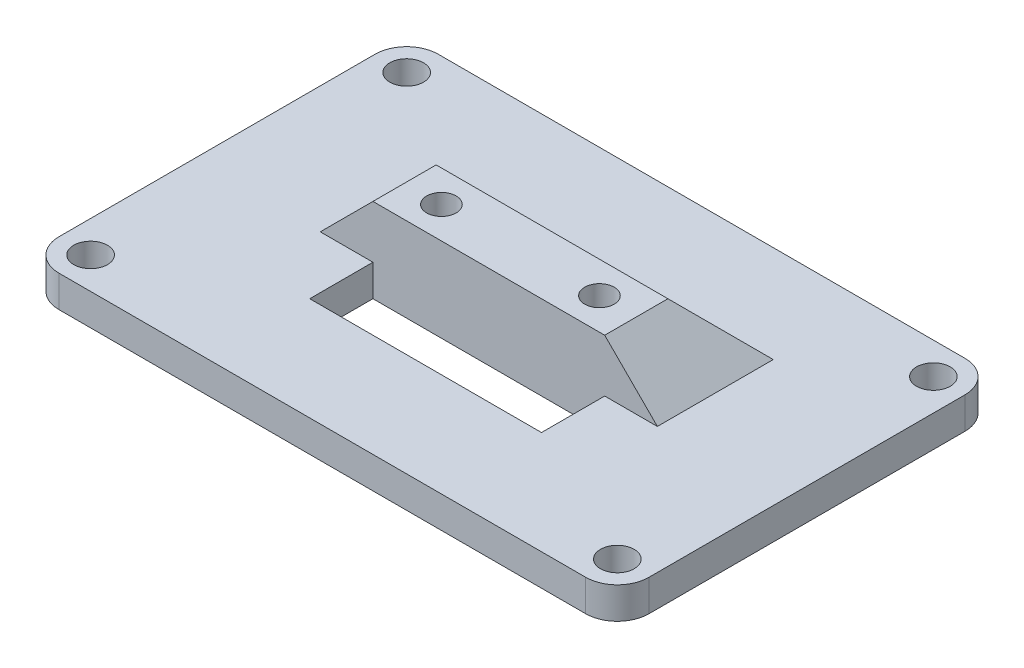
ISO-10303-21;
HEADER;
FILE_DESCRIPTION(('STEP AP214'),'2;1');
FILE_NAME('part.step','',(''),(''),'','','');
FILE_SCHEMA(('AUTOMOTIVE_DESIGN { 1 0 10303 214 1 1 1 1 }'));
ENDSEC;
DATA;
#1=APPLICATION_CONTEXT('core data for automotive mechanical design processes');
#2=APPLICATION_PROTOCOL_DEFINITION('international standard','automotive_design',2000,#1);
#3=PRODUCT_CONTEXT('',#1,'mechanical');
#4=PRODUCT('Part','Part','',(#3));
#5=PRODUCT_RELATED_PRODUCT_CATEGORY('part','',(#4));
#6=PRODUCT_DEFINITION_FORMATION('','',#4);
#7=PRODUCT_DEFINITION_CONTEXT('part definition',#1,'design');
#8=PRODUCT_DEFINITION('design','',#6,#7);
#9=PRODUCT_DEFINITION_SHAPE('','',#8);
#10=(LENGTH_UNIT() NAMED_UNIT(*) SI_UNIT(.MILLI.,.METRE.));
#11=(NAMED_UNIT(*) PLANE_ANGLE_UNIT() SI_UNIT($,.RADIAN.));
#12=(NAMED_UNIT(*) SI_UNIT($,.STERADIAN.) SOLID_ANGLE_UNIT());
#13=UNCERTAINTY_MEASURE_WITH_UNIT(LENGTH_MEASURE(1.E-05),#10,'distance_accuracy_value','');
#14=(GEOMETRIC_REPRESENTATION_CONTEXT(3) GLOBAL_UNCERTAINTY_ASSIGNED_CONTEXT((#13)) GLOBAL_UNIT_ASSIGNED_CONTEXT((#10,
#11,#12)) REPRESENTATION_CONTEXT('',''));
#15=CARTESIAN_POINT('',(0.,0.,0.));
#16=DIRECTION('',(0.,0.,1.));
#17=DIRECTION('',(1.,0.,0.));
#18=AXIS2_PLACEMENT_3D('',#15,#16,#17);
#19=CARTESIAN_POINT('',(0.,3.,0.));
#20=DIRECTION('',(0.,1.,0.));
#21=DIRECTION('',(0.,0.,1.));
#22=AXIS2_PLACEMENT_3D('',#19,#20,#21);
#23=PLANE('',#22);
#24=DIRECTION('',(0.,0.,1.));
#25=VECTOR('',#24,1.);
#26=CARTESIAN_POINT('',(16.,3.,0.));
#27=LINE('',#26,#25);
#28=CARTESIAN_POINT('',(16.,3.,-8.79999999999998));
#29=VERTEX_POINT('',#28);
#30=CARTESIAN_POINT('',(16.,3.,2.2));
#31=VERTEX_POINT('',#30);
#32=EDGE_CURVE('E354',#29,#31,#27,.T.);
#33=ORIENTED_EDGE('',*,*,#32,.T.);
#34=DIRECTION('',(-1.,0.,0.));
#35=VECTOR('',#34,1.);
#36=CARTESIAN_POINT('',(0.,3.,2.2));
#37=LINE('',#36,#35);
#38=CARTESIAN_POINT('',(11.,3.,2.2));
#39=VERTEX_POINT('',#38);
#40=EDGE_CURVE('E363',#31,#39,#37,.T.);
#41=ORIENTED_EDGE('',*,*,#40,.T.);
#42=DIRECTION('',(0.,0.,-1.));
#43=VECTOR('',#42,1.);
#44=CARTESIAN_POINT('',(11.,3.,8.2));
#45=LINE('',#44,#43);
#46=CARTESIAN_POINT('',(11.,3.,8.2));
#47=VERTEX_POINT('',#46);
#48=EDGE_CURVE('E181',#47,#39,#45,.T.);
#49=ORIENTED_EDGE('',*,*,#48,.F.);
#50=DIRECTION('',(1.,0.,0.));
#51=VECTOR('',#50,1.);
#52=CARTESIAN_POINT('',(-11.,3.,8.2));
#53=LINE('',#52,#51);
#54=CARTESIAN_POINT('',(-11.,3.,8.2));
#55=VERTEX_POINT('',#54);
#56=EDGE_CURVE('E185',#55,#47,#53,.T.);
#57=ORIENTED_EDGE('',*,*,#56,.F.);
#58=DIRECTION('',(0.,0.,1.));
#59=VECTOR('',#58,1.);
#60=CARTESIAN_POINT('',(-11.,3.,8.2));
#61=LINE('',#60,#59);
#62=CARTESIAN_POINT('',(-11.,3.,2.2));
#63=VERTEX_POINT('',#62);
#64=EDGE_CURVE('E160',#63,#55,#61,.T.);
#65=ORIENTED_EDGE('',*,*,#64,.F.);
#66=DIRECTION('',(-1.,0.,0.));
#67=VECTOR('',#66,1.);
#68=CARTESIAN_POINT('',(0.,3.,2.2));
#69=LINE('',#68,#67);
#70=CARTESIAN_POINT('',(-16.,3.,2.2));
#71=VERTEX_POINT('',#70);
#72=EDGE_CURVE('E59',#63,#71,#69,.T.);
#73=ORIENTED_EDGE('',*,*,#72,.T.);
#74=DIRECTION('',(0.,0.,-1.));
#75=VECTOR('',#74,1.);
#76=CARTESIAN_POINT('',(-16.,3.,0.));
#77=LINE('',#76,#75);
#78=CARTESIAN_POINT('',(-16.,3.,-8.79999999999998));
#79=VERTEX_POINT('',#78);
#80=EDGE_CURVE('E358',#71,#79,#77,.T.);
#81=ORIENTED_EDGE('',*,*,#80,.T.);
#82=DIRECTION('',(1.,0.,0.));
#83=VECTOR('',#82,1.);
#84=CARTESIAN_POINT('',(0.,3.,-8.79999999999998));
#85=LINE('',#84,#83);
#86=EDGE_CURVE('E351',#79,#29,#85,.T.);
#87=ORIENTED_EDGE('',*,*,#86,.T.);
#88=EDGE_LOOP('',(#33,#41,#49,#57,#65,#73,#81,#87));
#89=FACE_BOUND('',#88,.T.);
#90=CARTESIAN_POINT('',(25.,3.,15.));
#91=DIRECTION('',(0.,1.,0.));
#92=DIRECTION('',(0.,0.,1.));
#93=AXIS2_PLACEMENT_3D('',#90,#91,#92);
#94=CIRCLE('',#93,1.6);
#95=CARTESIAN_POINT('',(25.,3.,16.6));
#96=VERTEX_POINT('',#95);
#97=EDGE_CURVE('E236',#96,#96,#94,.T.);
#98=ORIENTED_EDGE('',*,*,#97,.F.);
#99=EDGE_LOOP('',(#98));
#100=FACE_BOUND('',#99,.T.);
#101=CARTESIAN_POINT('',(-25.,3.,-15.));
#102=DIRECTION('',(0.,1.,0.));
#103=DIRECTION('',(0.,0.,1.));
#104=AXIS2_PLACEMENT_3D('',#101,#102,#103);
#105=CIRCLE('',#104,1.6);
#106=CARTESIAN_POINT('',(-25.,3.,-13.4));
#107=VERTEX_POINT('',#106);
#108=EDGE_CURVE('E252',#107,#107,#105,.T.);
#109=ORIENTED_EDGE('',*,*,#108,.F.);
#110=EDGE_LOOP('',(#109));
#111=FACE_BOUND('',#110,.T.);
#112=DIRECTION('',(-1.,0.,0.));
#113=VECTOR('',#112,1.);
#114=CARTESIAN_POINT('',(-28.,3.,-18.));
#115=LINE('',#114,#113);
#116=CARTESIAN_POINT('',(25.,3.,-18.));
#117=VERTEX_POINT('',#116);
#118=CARTESIAN_POINT('',(-25.,3.,-18.));
#119=VERTEX_POINT('',#118);
#120=EDGE_CURVE('E264',#117,#119,#115,.T.);
#121=ORIENTED_EDGE('',*,*,#120,.T.);
#122=CARTESIAN_POINT('',(-25.,3.,-15.));
#123=DIRECTION('',(0.,1.,0.));
#124=DIRECTION('',(0.,0.,1.));
#125=AXIS2_PLACEMENT_3D('',#122,#123,#124);
#126=CIRCLE('',#125,3.);
#127=CARTESIAN_POINT('',(-28.,3.,-15.));
#128=VERTEX_POINT('',#127);
#129=EDGE_CURVE('E326',#119,#128,#126,.T.);
#130=ORIENTED_EDGE('',*,*,#129,.T.);
#131=DIRECTION('',(0.,0.,1.));
#132=VECTOR('',#131,1.);
#133=CARTESIAN_POINT('',(-28.,3.,-18.));
#134=LINE('',#133,#132);
#135=CARTESIAN_POINT('',(-28.,3.,15.));
#136=VERTEX_POINT('',#135);
#137=EDGE_CURVE('E269',#128,#136,#134,.T.);
#138=ORIENTED_EDGE('',*,*,#137,.T.);
#139=CARTESIAN_POINT('',(-25.,3.,15.));
#140=DIRECTION('',(0.,1.,0.));
#141=DIRECTION('',(0.,0.,1.));
#142=AXIS2_PLACEMENT_3D('',#139,#140,#141);
#143=CIRCLE('',#142,3.);
#144=CARTESIAN_POINT('',(-25.,3.,18.));
#145=VERTEX_POINT('',#144);
#146=EDGE_CURVE('E317',#136,#145,#143,.T.);
#147=ORIENTED_EDGE('',*,*,#146,.T.);
#148=DIRECTION('',(1.,0.,0.));
#149=VECTOR('',#148,1.);
#150=CARTESIAN_POINT('',(-28.,3.,18.));
#151=LINE('',#150,#149);
#152=CARTESIAN_POINT('',(25.,3.,18.));
#153=VERTEX_POINT('',#152);
#154=EDGE_CURVE('E273',#145,#153,#151,.T.);
#155=ORIENTED_EDGE('',*,*,#154,.T.);
#156=CARTESIAN_POINT('',(25.,3.,15.));
#157=DIRECTION('',(0.,1.,0.));
#158=DIRECTION('',(0.,0.,1.));
#159=AXIS2_PLACEMENT_3D('',#156,#157,#158);
#160=CIRCLE('',#159,3.);
#161=CARTESIAN_POINT('',(28.,3.,15.));
#162=VERTEX_POINT('',#161);
#163=EDGE_CURVE('E320',#153,#162,#160,.T.);
#164=ORIENTED_EDGE('',*,*,#163,.T.);
#165=DIRECTION('',(0.,0.,-1.));
#166=VECTOR('',#165,1.);
#167=CARTESIAN_POINT('',(28.,3.,-18.));
#168=LINE('',#167,#166);
#169=CARTESIAN_POINT('',(28.,3.,-15.));
#170=VERTEX_POINT('',#169);
#171=EDGE_CURVE('E260',#162,#170,#168,.T.);
#172=ORIENTED_EDGE('',*,*,#171,.T.);
#173=CARTESIAN_POINT('',(25.,3.,-15.));
#174=DIRECTION('',(0.,1.,0.));
#175=DIRECTION('',(0.,0.,1.));
#176=AXIS2_PLACEMENT_3D('',#173,#174,#175);
#177=CIRCLE('',#176,3.);
#178=EDGE_CURVE('E323',#170,#117,#177,.T.);
#179=ORIENTED_EDGE('',*,*,#178,.T.);
#180=EDGE_LOOP('',(#121,#130,#138,#147,#155,#164,#172,#179));
#181=FACE_BOUND('',#180,.T.);
#182=CARTESIAN_POINT('',(25.,3.,-15.));
#183=DIRECTION('',(0.,1.,0.));
#184=DIRECTION('',(0.,0.,1.));
#185=AXIS2_PLACEMENT_3D('',#182,#183,#184);
#186=CIRCLE('',#185,1.6);
#187=CARTESIAN_POINT('',(25.,3.,-13.4));
#188=VERTEX_POINT('',#187);
#189=EDGE_CURVE('E244',#188,#188,#186,.T.);
#190=ORIENTED_EDGE('',*,*,#189,.F.);
#191=EDGE_LOOP('',(#190));
#192=FACE_BOUND('',#191,.T.);
#193=CARTESIAN_POINT('',(-25.,3.,15.));
#194=DIRECTION('',(0.,1.,0.));
#195=DIRECTION('',(0.,0.,1.));
#196=AXIS2_PLACEMENT_3D('',#193,#194,#195);
#197=CIRCLE('',#196,1.6);
#198=CARTESIAN_POINT('',(-25.,3.,16.6));
#199=VERTEX_POINT('',#198);
#200=EDGE_CURVE('E228',#199,#199,#197,.T.);
#201=ORIENTED_EDGE('',*,*,#200,.F.);
#202=EDGE_LOOP('',(#201));
#203=FACE_BOUND('',#202,.T.);
#204=ADVANCED_FACE('F40',(#89,#100,#111,#181,#192,#203),#23,.T.);
#205=CARTESIAN_POINT('',(0.,0.,0.));
#206=DIRECTION('',(0.,1.,0.));
#207=DIRECTION('',(0.,0.,1.));
#208=AXIS2_PLACEMENT_3D('',#205,#206,#207);
#209=PLANE('',#208);
#210=DIRECTION('',(-1.,0.,0.));
#211=VECTOR('',#210,1.);
#212=CARTESIAN_POINT('',(-11.,0.,2.2));
#213=LINE('',#212,#211);
#214=CARTESIAN_POINT('',(11.,0.,2.2));
#215=VERTEX_POINT('',#214);
#216=CARTESIAN_POINT('',(-11.,0.,2.2));
#217=VERTEX_POINT('',#216);
#218=EDGE_CURVE('E166',#215,#217,#213,.T.);
#219=ORIENTED_EDGE('',*,*,#218,.T.);
#220=DIRECTION('',(0.,0.,1.));
#221=VECTOR('',#220,1.);
#222=CARTESIAN_POINT('',(-11.,0.,8.2));
#223=LINE('',#222,#221);
#224=CARTESIAN_POINT('',(-11.,0.,8.2));
#225=VERTEX_POINT('',#224);
#226=EDGE_CURVE('E158',#217,#225,#223,.T.);
#227=ORIENTED_EDGE('',*,*,#226,.T.);
#228=DIRECTION('',(1.,0.,0.));
#229=VECTOR('',#228,1.);
#230=CARTESIAN_POINT('',(-11.,0.,8.2));
#231=LINE('',#230,#229);
#232=CARTESIAN_POINT('',(11.,0.,8.2));
#233=VERTEX_POINT('',#232);
#234=EDGE_CURVE('E170',#225,#233,#231,.T.);
#235=ORIENTED_EDGE('',*,*,#234,.T.);
#236=DIRECTION('',(0.,0.,-1.));
#237=VECTOR('',#236,1.);
#238=CARTESIAN_POINT('',(11.,0.,8.2));
#239=LINE('',#238,#237);
#240=EDGE_CURVE('E175',#233,#215,#239,.T.);
#241=ORIENTED_EDGE('',*,*,#240,.T.);
#242=EDGE_LOOP('',(#219,#227,#235,#241));
#243=FACE_BOUND('',#242,.T.);
#244=DIRECTION('',(0.,0.,1.));
#245=VECTOR('',#244,1.);
#246=CARTESIAN_POINT('',(-28.,0.,-18.));
#247=LINE('',#246,#245);
#248=CARTESIAN_POINT('',(-28.,0.,-15.));
#249=VERTEX_POINT('',#248);
#250=CARTESIAN_POINT('',(-28.,0.,15.));
#251=VERTEX_POINT('',#250);
#252=EDGE_CURVE('E285',#249,#251,#247,.T.);
#253=ORIENTED_EDGE('',*,*,#252,.F.);
#254=CARTESIAN_POINT('',(-25.,0.,-15.));
#255=DIRECTION('',(0.,1.,0.));
#256=DIRECTION('',(0.,0.,1.));
#257=AXIS2_PLACEMENT_3D('',#254,#255,#256);
#258=CIRCLE('',#257,3.);
#259=CARTESIAN_POINT('',(-25.,0.,-18.));
#260=VERTEX_POINT('',#259);
#261=EDGE_CURVE('E307',#249,#260,#258,.F.);
#262=ORIENTED_EDGE('',*,*,#261,.T.);
#263=DIRECTION('',(-1.,0.,0.));
#264=VECTOR('',#263,1.);
#265=CARTESIAN_POINT('',(-28.,0.,-18.));
#266=LINE('',#265,#264);
#267=CARTESIAN_POINT('',(25.,0.,-18.));
#268=VERTEX_POINT('',#267);
#269=EDGE_CURVE('E281',#268,#260,#266,.T.);
#270=ORIENTED_EDGE('',*,*,#269,.F.);
#271=CARTESIAN_POINT('',(25.,0.,-15.));
#272=DIRECTION('',(0.,1.,0.));
#273=DIRECTION('',(0.,0.,1.));
#274=AXIS2_PLACEMENT_3D('',#271,#272,#273);
#275=CIRCLE('',#274,3.);
#276=CARTESIAN_POINT('',(28.,0.,-15.));
#277=VERTEX_POINT('',#276);
#278=EDGE_CURVE('E304',#268,#277,#275,.F.);
#279=ORIENTED_EDGE('',*,*,#278,.T.);
#280=DIRECTION('',(0.,0.,-1.));
#281=VECTOR('',#280,1.);
#282=CARTESIAN_POINT('',(28.,0.,-18.));
#283=LINE('',#282,#281);
#284=CARTESIAN_POINT('',(28.,0.,15.));
#285=VERTEX_POINT('',#284);
#286=EDGE_CURVE('E256',#285,#277,#283,.T.);
#287=ORIENTED_EDGE('',*,*,#286,.F.);
#288=CARTESIAN_POINT('',(25.,0.,15.));
#289=DIRECTION('',(0.,1.,0.));
#290=DIRECTION('',(0.,0.,1.));
#291=AXIS2_PLACEMENT_3D('',#288,#289,#290);
#292=CIRCLE('',#291,3.);
#293=CARTESIAN_POINT('',(25.,0.,18.));
#294=VERTEX_POINT('',#293);
#295=EDGE_CURVE('E301',#285,#294,#292,.F.);
#296=ORIENTED_EDGE('',*,*,#295,.T.);
#297=DIRECTION('',(1.,0.,0.));
#298=VECTOR('',#297,1.);
#299=CARTESIAN_POINT('',(-28.,0.,18.));
#300=LINE('',#299,#298);
#301=CARTESIAN_POINT('',(-25.,0.,18.));
#302=VERTEX_POINT('',#301);
#303=EDGE_CURVE('E265',#302,#294,#300,.T.);
#304=ORIENTED_EDGE('',*,*,#303,.F.);
#305=CARTESIAN_POINT('',(-25.,0.,15.));
#306=DIRECTION('',(0.,1.,0.));
#307=DIRECTION('',(0.,0.,1.));
#308=AXIS2_PLACEMENT_3D('',#305,#306,#307);
#309=CIRCLE('',#308,3.);
#310=EDGE_CURVE('E298',#302,#251,#309,.F.);
#311=ORIENTED_EDGE('',*,*,#310,.T.);
#312=EDGE_LOOP('',(#253,#262,#270,#279,#287,#296,#304,#311));
#313=FACE_BOUND('',#312,.T.);
#314=CARTESIAN_POINT('',(-25.,0.,-15.));
#315=DIRECTION('',(0.,1.,0.));
#316=DIRECTION('',(0.,0.,1.));
#317=AXIS2_PLACEMENT_3D('',#314,#315,#316);
#318=CIRCLE('',#317,1.6);
#319=CARTESIAN_POINT('',(-25.,0.,-13.4));
#320=VERTEX_POINT('',#319);
#321=EDGE_CURVE('E248',#320,#320,#318,.T.);
#322=ORIENTED_EDGE('',*,*,#321,.T.);
#323=EDGE_LOOP('',(#322));
#324=FACE_BOUND('',#323,.T.);
#325=CARTESIAN_POINT('',(25.,0.,-15.));
#326=DIRECTION('',(0.,1.,0.));
#327=DIRECTION('',(0.,0.,1.));
#328=AXIS2_PLACEMENT_3D('',#325,#326,#327);
#329=CIRCLE('',#328,1.6);
#330=CARTESIAN_POINT('',(25.,0.,-13.4));
#331=VERTEX_POINT('',#330);
#332=EDGE_CURVE('E240',#331,#331,#329,.T.);
#333=ORIENTED_EDGE('',*,*,#332,.T.);
#334=EDGE_LOOP('',(#333));
#335=FACE_BOUND('',#334,.T.);
#336=CARTESIAN_POINT('',(25.,0.,15.));
#337=DIRECTION('',(0.,1.,0.));
#338=DIRECTION('',(0.,0.,1.));
#339=AXIS2_PLACEMENT_3D('',#336,#337,#338);
#340=CIRCLE('',#339,1.6);
#341=CARTESIAN_POINT('',(25.,0.,16.6));
#342=VERTEX_POINT('',#341);
#343=EDGE_CURVE('E232',#342,#342,#340,.T.);
#344=ORIENTED_EDGE('',*,*,#343,.T.);
#345=EDGE_LOOP('',(#344));
#346=FACE_BOUND('',#345,.T.);
#347=CARTESIAN_POINT('',(-25.,0.,15.));
#348=DIRECTION('',(0.,1.,0.));
#349=DIRECTION('',(0.,0.,1.));
#350=AXIS2_PLACEMENT_3D('',#347,#348,#349);
#351=CIRCLE('',#350,1.6);
#352=CARTESIAN_POINT('',(-25.,0.,16.6));
#353=VERTEX_POINT('',#352);
#354=EDGE_CURVE('E227',#353,#353,#351,.T.);
#355=ORIENTED_EDGE('',*,*,#354,.T.);
#356=EDGE_LOOP('',(#355));
#357=FACE_BOUND('',#356,.T.);
#358=ADVANCED_FACE('F177',(#243,#313,#324,#335,#346,#357),#209,.F.);
#359=CARTESIAN_POINT('',(28.,3.,-18.));
#360=DIRECTION('',(-1.,0.,0.));
#361=DIRECTION('',(0.,0.,1.));
#362=AXIS2_PLACEMENT_3D('',#359,#360,#361);
#363=PLANE('',#362);
#364=ORIENTED_EDGE('',*,*,#286,.T.);
#365=DIRECTION('',(0.,-1.,0.));
#366=VECTOR('',#365,1.);
#367=CARTESIAN_POINT('',(28.,3.,-15.));
#368=LINE('',#367,#366);
#369=EDGE_CURVE('E333',#277,#170,#368,.F.);
#370=ORIENTED_EDGE('',*,*,#369,.T.);
#371=ORIENTED_EDGE('',*,*,#171,.F.);
#372=DIRECTION('',(0.,-1.,0.));
#373=VECTOR('',#372,1.);
#374=CARTESIAN_POINT('',(28.,3.,15.));
#375=LINE('',#374,#373);
#376=EDGE_CURVE('E329',#162,#285,#375,.T.);
#377=ORIENTED_EDGE('',*,*,#376,.T.);
#378=EDGE_LOOP('',(#364,#370,#371,#377));
#379=FACE_BOUND('',#378,.T.);
#380=ADVANCED_FACE('F412',(#379),#363,.F.);
#381=CARTESIAN_POINT('',(-28.,3.,-18.));
#382=DIRECTION('',(0.,0.,1.));
#383=DIRECTION('',(1.,0.,0.));
#384=AXIS2_PLACEMENT_3D('',#381,#382,#383);
#385=PLANE('',#384);
#386=ORIENTED_EDGE('',*,*,#269,.T.);
#387=DIRECTION('',(0.,-1.,0.));
#388=VECTOR('',#387,1.);
#389=CARTESIAN_POINT('',(-25.,3.,-18.));
#390=LINE('',#389,#388);
#391=EDGE_CURVE('E314',#260,#119,#390,.F.);
#392=ORIENTED_EDGE('',*,*,#391,.T.);
#393=ORIENTED_EDGE('',*,*,#120,.F.);
#394=DIRECTION('',(0.,-1.,0.));
#395=VECTOR('',#394,1.);
#396=CARTESIAN_POINT('',(25.,3.,-18.));
#397=LINE('',#396,#395);
#398=EDGE_CURVE('E310',#117,#268,#397,.T.);
#399=ORIENTED_EDGE('',*,*,#398,.T.);
#400=EDGE_LOOP('',(#386,#392,#393,#399));
#401=FACE_BOUND('',#400,.T.);
#402=ADVANCED_FACE('F509',(#401),#385,.F.);
#403=CARTESIAN_POINT('',(-28.,3.,-18.));
#404=DIRECTION('',(1.,0.,0.));
#405=DIRECTION('',(0.,0.,-1.));
#406=AXIS2_PLACEMENT_3D('',#403,#404,#405);
#407=PLANE('',#406);
#408=ORIENTED_EDGE('',*,*,#137,.F.);
#409=DIRECTION('',(0.,-1.,0.));
#410=VECTOR('',#409,1.);
#411=CARTESIAN_POINT('',(-28.,3.,-15.));
#412=LINE('',#411,#410);
#413=EDGE_CURVE('E294',#128,#249,#412,.T.);
#414=ORIENTED_EDGE('',*,*,#413,.T.);
#415=ORIENTED_EDGE('',*,*,#252,.T.);
#416=DIRECTION('',(0.,-1.,0.));
#417=VECTOR('',#416,1.);
#418=CARTESIAN_POINT('',(-28.,3.,15.));
#419=LINE('',#418,#417);
#420=EDGE_CURVE('E277',#251,#136,#419,.F.);
#421=ORIENTED_EDGE('',*,*,#420,.T.);
#422=EDGE_LOOP('',(#408,#414,#415,#421));
#423=FACE_BOUND('',#422,.T.);
#424=ADVANCED_FACE('F458',(#423),#407,.F.);
#425=CARTESIAN_POINT('',(-28.,3.,18.));
#426=DIRECTION('',(0.,0.,-1.));
#427=DIRECTION('',(-1.,0.,0.));
#428=AXIS2_PLACEMENT_3D('',#425,#426,#427);
#429=PLANE('',#428);
#430=ORIENTED_EDGE('',*,*,#303,.T.);
#431=DIRECTION('',(0.,-1.,0.));
#432=VECTOR('',#431,1.);
#433=CARTESIAN_POINT('',(25.,3.,18.));
#434=LINE('',#433,#432);
#435=EDGE_CURVE('E340',#294,#153,#434,.F.);
#436=ORIENTED_EDGE('',*,*,#435,.T.);
#437=ORIENTED_EDGE('',*,*,#154,.F.);
#438=DIRECTION('',(0.,-1.,0.));
#439=VECTOR('',#438,1.);
#440=CARTESIAN_POINT('',(-25.,3.,18.));
#441=LINE('',#440,#439);
#442=EDGE_CURVE('E336',#145,#302,#441,.T.);
#443=ORIENTED_EDGE('',*,*,#442,.T.);
#444=EDGE_LOOP('',(#430,#436,#437,#443));
#445=FACE_BOUND('',#444,.T.);
#446=ADVANCED_FACE('F453',(#445),#429,.F.);
#447=CARTESIAN_POINT('',(-25.,3.,-15.));
#448=DIRECTION('',(0.,-1.,0.));
#449=DIRECTION('',(0.,0.,-1.));
#450=AXIS2_PLACEMENT_3D('',#447,#448,#449);
#451=CYLINDRICAL_SURFACE('',#450,1.6);
#452=ORIENTED_EDGE('',*,*,#108,.T.);
#453=EDGE_LOOP('',(#452));
#454=FACE_BOUND('',#453,.T.);
#455=ORIENTED_EDGE('',*,*,#321,.F.);
#456=EDGE_LOOP('',(#455));
#457=FACE_BOUND('',#456,.T.);
#458=ADVANCED_FACE('F450',(#454,#457),#451,.F.);
#459=CARTESIAN_POINT('',(25.,3.,-15.));
#460=DIRECTION('',(0.,-1.,0.));
#461=DIRECTION('',(0.,0.,-1.));
#462=AXIS2_PLACEMENT_3D('',#459,#460,#461);
#463=CYLINDRICAL_SURFACE('',#462,1.6);
#464=ORIENTED_EDGE('',*,*,#189,.T.);
#465=EDGE_LOOP('',(#464));
#466=FACE_BOUND('',#465,.T.);
#467=ORIENTED_EDGE('',*,*,#332,.F.);
#468=EDGE_LOOP('',(#467));
#469=FACE_BOUND('',#468,.T.);
#470=ADVANCED_FACE('F447',(#466,#469),#463,.F.);
#471=CARTESIAN_POINT('',(25.,3.,15.));
#472=DIRECTION('',(0.,-1.,0.));
#473=DIRECTION('',(0.,0.,-1.));
#474=AXIS2_PLACEMENT_3D('',#471,#472,#473);
#475=CYLINDRICAL_SURFACE('',#474,1.6);
#476=ORIENTED_EDGE('',*,*,#97,.T.);
#477=EDGE_LOOP('',(#476));
#478=FACE_BOUND('',#477,.T.);
#479=ORIENTED_EDGE('',*,*,#343,.F.);
#480=EDGE_LOOP('',(#479));
#481=FACE_BOUND('',#480,.T.);
#482=ADVANCED_FACE('F443',(#478,#481),#475,.F.);
#483=CARTESIAN_POINT('',(-25.,3.,15.));
#484=DIRECTION('',(0.,-1.,0.));
#485=DIRECTION('',(0.,0.,-1.));
#486=AXIS2_PLACEMENT_3D('',#483,#484,#485);
#487=CYLINDRICAL_SURFACE('',#486,1.6);
#488=ORIENTED_EDGE('',*,*,#200,.T.);
#489=EDGE_LOOP('',(#488));
#490=FACE_BOUND('',#489,.T.);
#491=ORIENTED_EDGE('',*,*,#354,.F.);
#492=EDGE_LOOP('',(#491));
#493=FACE_BOUND('',#492,.T.);
#494=ADVANCED_FACE('F439',(#490,#493),#487,.F.);
#495=CARTESIAN_POINT('',(-25.,3.,-15.));
#496=DIRECTION('',(0.,-1.,0.));
#497=DIRECTION('',(0.,0.,-1.));
#498=AXIS2_PLACEMENT_3D('',#495,#496,#497);
#499=CYLINDRICAL_SURFACE('',#498,3.);
#500=ORIENTED_EDGE('',*,*,#129,.F.);
#501=ORIENTED_EDGE('',*,*,#391,.F.);
#502=ORIENTED_EDGE('',*,*,#261,.F.);
#503=ORIENTED_EDGE('',*,*,#413,.F.);
#504=EDGE_LOOP('',(#500,#501,#502,#503));
#505=FACE_BOUND('',#504,.T.);
#506=ADVANCED_FACE('F442',(#505),#499,.T.);
#507=CARTESIAN_POINT('',(25.,3.,-15.));
#508=DIRECTION('',(0.,-1.,0.));
#509=DIRECTION('',(0.,0.,-1.));
#510=AXIS2_PLACEMENT_3D('',#507,#508,#509);
#511=CYLINDRICAL_SURFACE('',#510,3.);
#512=ORIENTED_EDGE('',*,*,#178,.F.);
#513=ORIENTED_EDGE('',*,*,#369,.F.);
#514=ORIENTED_EDGE('',*,*,#278,.F.);
#515=ORIENTED_EDGE('',*,*,#398,.F.);
#516=EDGE_LOOP('',(#512,#513,#514,#515));
#517=FACE_BOUND('',#516,.T.);
#518=ADVANCED_FACE('F508',(#517),#511,.T.);
#519=CARTESIAN_POINT('',(25.,3.,15.));
#520=DIRECTION('',(0.,-1.,0.));
#521=DIRECTION('',(0.,0.,-1.));
#522=AXIS2_PLACEMENT_3D('',#519,#520,#521);
#523=CYLINDRICAL_SURFACE('',#522,3.);
#524=ORIENTED_EDGE('',*,*,#163,.F.);
#525=ORIENTED_EDGE('',*,*,#435,.F.);
#526=ORIENTED_EDGE('',*,*,#295,.F.);
#527=ORIENTED_EDGE('',*,*,#376,.F.);
#528=EDGE_LOOP('',(#524,#525,#526,#527));
#529=FACE_BOUND('',#528,.T.);
#530=ADVANCED_FACE('F503',(#529),#523,.T.);
#531=CARTESIAN_POINT('',(-25.,3.,15.));
#532=DIRECTION('',(0.,-1.,0.));
#533=DIRECTION('',(0.,0.,-1.));
#534=AXIS2_PLACEMENT_3D('',#531,#532,#533);
#535=CYLINDRICAL_SURFACE('',#534,3.);
#536=ORIENTED_EDGE('',*,*,#146,.F.);
#537=ORIENTED_EDGE('',*,*,#420,.F.);
#538=ORIENTED_EDGE('',*,*,#310,.F.);
#539=ORIENTED_EDGE('',*,*,#442,.F.);
#540=EDGE_LOOP('',(#536,#537,#538,#539));
#541=FACE_BOUND('',#540,.T.);
#542=ADVANCED_FACE('F435',(#541),#535,.T.);
#543=CARTESIAN_POINT('',(0.,8.,0.));
#544=DIRECTION('',(0.,1.,0.));
#545=DIRECTION('',(0.,0.,1.));
#546=AXIS2_PLACEMENT_3D('',#543,#544,#545);
#547=PLANE('',#546);
#548=CARTESIAN_POINT('',(-7.5,8.,-0.8));
#549=DIRECTION('',(0.,1.,0.));
#550=DIRECTION('',(0.,0.,1.));
#551=AXIS2_PLACEMENT_3D('',#548,#549,#550);
#552=CIRCLE('',#551,1.4);
#553=CARTESIAN_POINT('',(-7.5,8.,0.6));
#554=VERTEX_POINT('',#553);
#555=EDGE_CURVE('E209',#554,#554,#552,.T.);
#556=ORIENTED_EDGE('',*,*,#555,.F.);
#557=EDGE_LOOP('',(#556));
#558=FACE_BOUND('',#557,.T.);
#559=DIRECTION('',(0.,0.,-1.));
#560=VECTOR('',#559,1.);
#561=CARTESIAN_POINT('',(11.,8.,-3.8));
#562=LINE('',#561,#560);
#563=CARTESIAN_POINT('',(11.,8.,2.2));
#564=VERTEX_POINT('',#563);
#565=CARTESIAN_POINT('',(11.,8.,-3.8));
#566=VERTEX_POINT('',#565);
#567=EDGE_CURVE('E213',#564,#566,#562,.T.);
#568=ORIENTED_EDGE('',*,*,#567,.T.);
#569=DIRECTION('',(-1.,0.,0.));
#570=VECTOR('',#569,1.);
#571=CARTESIAN_POINT('',(-11.,8.,-3.8));
#572=LINE('',#571,#570);
#573=CARTESIAN_POINT('',(-11.,8.,-3.8));
#574=VERTEX_POINT('',#573);
#575=EDGE_CURVE('E216',#566,#574,#572,.T.);
#576=ORIENTED_EDGE('',*,*,#575,.T.);
#577=DIRECTION('',(0.,0.,1.));
#578=VECTOR('',#577,1.);
#579=CARTESIAN_POINT('',(-11.,8.,-3.8));
#580=LINE('',#579,#578);
#581=CARTESIAN_POINT('',(-11.,8.,2.2));
#582=VERTEX_POINT('',#581);
#583=EDGE_CURVE('E219',#574,#582,#580,.T.);
#584=ORIENTED_EDGE('',*,*,#583,.T.);
#585=DIRECTION('',(1.,0.,0.));
#586=VECTOR('',#585,1.);
#587=CARTESIAN_POINT('',(-11.,8.,2.2));
#588=LINE('',#587,#586);
#589=EDGE_CURVE('E223',#582,#564,#588,.T.);
#590=ORIENTED_EDGE('',*,*,#589,.T.);
#591=EDGE_LOOP('',(#568,#576,#584,#590));
#592=FACE_BOUND('',#591,.T.);
#593=CARTESIAN_POINT('',(7.5,8.,-0.800000000000003));
#594=DIRECTION('',(0.,1.,0.));
#595=DIRECTION('',(0.,0.,1.));
#596=AXIS2_PLACEMENT_3D('',#593,#594,#595);
#597=CIRCLE('',#596,1.4);
#598=CARTESIAN_POINT('',(7.5,8.,0.599999999999997));
#599=VERTEX_POINT('',#598);
#600=EDGE_CURVE('E199',#599,#599,#597,.T.);
#601=ORIENTED_EDGE('',*,*,#600,.F.);
#602=EDGE_LOOP('',(#601));
#603=FACE_BOUND('',#602,.T.);
#604=ADVANCED_FACE('F390',(#558,#592,#603),#547,.T.);
#605=CARTESIAN_POINT('',(-11.,8.,2.2));
#606=DIRECTION('',(0.,0.,-1.));
#607=DIRECTION('',(-1.,0.,0.));
#608=AXIS2_PLACEMENT_3D('',#605,#606,#607);
#609=PLANE('',#608);
#610=ORIENTED_EDGE('',*,*,#589,.F.);
#611=DIRECTION('',(-0.707106781186546,-0.707106781186549,0.));
#612=VECTOR('',#611,1.);
#613=CARTESIAN_POINT('',(-11.,8.,2.2));
#614=LINE('',#613,#612);
#615=EDGE_CURVE('E51',#582,#71,#614,.T.);
#616=ORIENTED_EDGE('',*,*,#615,.T.);
#617=ORIENTED_EDGE('',*,*,#72,.F.);
#618=DIRECTION('',(0.,1.,0.));
#619=VECTOR('',#618,1.);
#620=CARTESIAN_POINT('',(-11.,0.,2.2));
#621=LINE('',#620,#619);
#622=EDGE_CURVE('E196',#217,#63,#621,.T.);
#623=ORIENTED_EDGE('',*,*,#622,.F.);
#624=ORIENTED_EDGE('',*,*,#218,.F.);
#625=DIRECTION('',(0.,1.,0.));
#626=VECTOR('',#625,1.);
#627=CARTESIAN_POINT('',(11.,0.,2.2));
#628=LINE('',#627,#626);
#629=EDGE_CURVE('E200',#215,#39,#628,.T.);
#630=ORIENTED_EDGE('',*,*,#629,.T.);
#631=ORIENTED_EDGE('',*,*,#40,.F.);
#632=DIRECTION('',(-0.707106781186546,0.707106781186549,0.));
#633=VECTOR('',#632,1.);
#634=CARTESIAN_POINT('',(0.,19.,2.2));
#635=LINE('',#634,#633);
#636=EDGE_CURVE('E11',#31,#564,#635,.T.);
#637=ORIENTED_EDGE('',*,*,#636,.T.);
#638=EDGE_LOOP('',(#610,#616,#617,#623,#624,#630,#631,#637));
#639=FACE_BOUND('',#638,.T.);
#640=ADVANCED_FACE('F392',(#639),#609,.F.);
#641=CARTESIAN_POINT('',(-7.5,8.,-0.8));
#642=DIRECTION('',(0.,-1.,0.));
#643=DIRECTION('',(0.,0.,-1.));
#644=AXIS2_PLACEMENT_3D('',#641,#642,#643);
#645=CYLINDRICAL_SURFACE('',#644,1.4);
#646=ORIENTED_EDGE('',*,*,#555,.T.);
#647=EDGE_LOOP('',(#646));
#648=FACE_BOUND('',#647,.T.);
#649=CARTESIAN_POINT('',(-7.5,3.,-0.8));
#650=DIRECTION('',(0.,1.,0.));
#651=DIRECTION('',(0.,0.,1.));
#652=AXIS2_PLACEMENT_3D('',#649,#650,#651);
#653=CIRCLE('',#652,1.4);
#654=CARTESIAN_POINT('',(-7.5,3.,0.6));
#655=VERTEX_POINT('',#654);
#656=EDGE_CURVE('E347',#655,#655,#653,.F.);
#657=ORIENTED_EDGE('',*,*,#656,.T.);
#658=EDGE_LOOP('',(#657));
#659=FACE_BOUND('',#658,.T.);
#660=ADVANCED_FACE('F423',(#648,#659),#645,.F.);
#661=CARTESIAN_POINT('',(7.5,8.,-0.800000000000003));
#662=DIRECTION('',(0.,-1.,0.));
#663=DIRECTION('',(0.,0.,-1.));
#664=AXIS2_PLACEMENT_3D('',#661,#662,#663);
#665=CYLINDRICAL_SURFACE('',#664,1.4);
#666=ORIENTED_EDGE('',*,*,#600,.T.);
#667=EDGE_LOOP('',(#666));
#668=FACE_BOUND('',#667,.T.);
#669=CARTESIAN_POINT('',(7.5,3.,-0.800000000000003));
#670=DIRECTION('',(0.,1.,0.));
#671=DIRECTION('',(0.,0.,1.));
#672=AXIS2_PLACEMENT_3D('',#669,#670,#671);
#673=CIRCLE('',#672,1.4);
#674=CARTESIAN_POINT('',(7.5,3.,0.599999999999997));
#675=VERTEX_POINT('',#674);
#676=EDGE_CURVE('E343',#675,#675,#673,.F.);
#677=ORIENTED_EDGE('',*,*,#676,.T.);
#678=EDGE_LOOP('',(#677));
#679=FACE_BOUND('',#678,.T.);
#680=ADVANCED_FACE('F418',(#668,#679),#665,.F.);
#681=ORIENTED_EDGE('',*,*,#676,.F.);
#682=EDGE_LOOP('',(#681));
#683=FACE_BOUND('',#682,.T.);
#684=ADVANCED_FACE('F406',(#683),#23,.T.);
#685=ORIENTED_EDGE('',*,*,#656,.F.);
#686=EDGE_LOOP('',(#685));
#687=FACE_BOUND('',#686,.T.);
#688=ADVANCED_FACE('F402',(#687),#23,.T.);
#689=CARTESIAN_POINT('',(-11.,0.,8.2));
#690=DIRECTION('',(-1.,0.,0.));
#691=DIRECTION('',(0.,0.,1.));
#692=AXIS2_PLACEMENT_3D('',#689,#690,#691);
#693=PLANE('',#692);
#694=ORIENTED_EDGE('',*,*,#64,.T.);
#695=DIRECTION('',(0.,1.,0.));
#696=VECTOR('',#695,1.);
#697=CARTESIAN_POINT('',(-11.,0.,8.2));
#698=LINE('',#697,#696);
#699=EDGE_CURVE('E153',#225,#55,#698,.T.);
#700=ORIENTED_EDGE('',*,*,#699,.F.);
#701=ORIENTED_EDGE('',*,*,#226,.F.);
#702=ORIENTED_EDGE('',*,*,#622,.T.);
#703=EDGE_LOOP('',(#694,#700,#701,#702));
#704=FACE_BOUND('',#703,.T.);
#705=ADVANCED_FACE('F155',(#704),#693,.F.);
#706=CARTESIAN_POINT('',(11.,0.,8.2));
#707=DIRECTION('',(1.,0.,0.));
#708=DIRECTION('',(0.,0.,-1.));
#709=AXIS2_PLACEMENT_3D('',#706,#707,#708);
#710=PLANE('',#709);
#711=ORIENTED_EDGE('',*,*,#48,.T.);
#712=ORIENTED_EDGE('',*,*,#629,.F.);
#713=ORIENTED_EDGE('',*,*,#240,.F.);
#714=DIRECTION('',(0.,1.,0.));
#715=VECTOR('',#714,1.);
#716=CARTESIAN_POINT('',(11.,0.,8.2));
#717=LINE('',#716,#715);
#718=EDGE_CURVE('E165',#233,#47,#717,.T.);
#719=ORIENTED_EDGE('',*,*,#718,.T.);
#720=EDGE_LOOP('',(#711,#712,#713,#719));
#721=FACE_BOUND('',#720,.T.);
#722=ADVANCED_FACE('F394',(#721),#710,.F.);
#723=CARTESIAN_POINT('',(-11.,0.,8.2));
#724=DIRECTION('',(0.,0.,1.));
#725=DIRECTION('',(1.,0.,0.));
#726=AXIS2_PLACEMENT_3D('',#723,#724,#725);
#727=PLANE('',#726);
#728=ORIENTED_EDGE('',*,*,#56,.T.);
#729=ORIENTED_EDGE('',*,*,#718,.F.);
#730=ORIENTED_EDGE('',*,*,#234,.F.);
#731=ORIENTED_EDGE('',*,*,#699,.T.);
#732=EDGE_LOOP('',(#728,#729,#730,#731));
#733=FACE_BOUND('',#732,.T.);
#734=ADVANCED_FACE('F171',(#733),#727,.F.);
#735=CARTESIAN_POINT('',(11.,8.,-3.8));
#736=DIRECTION('',(-0.707106781186549,-0.707106781186546,0.));
#737=DIRECTION('',(0.,0.,-1.));
#738=AXIS2_PLACEMENT_3D('',#735,#736,#737);
#739=PLANE('',#738);
#740=ORIENTED_EDGE('',*,*,#636,.F.);
#741=ORIENTED_EDGE('',*,*,#32,.F.);
#742=DIRECTION('',(0.577350269189625,-0.577350269189627,-0.577350269189625));
#743=VECTOR('',#742,1.);
#744=CARTESIAN_POINT('',(3.66666666666668,15.3333333333333,3.53333333333332));
#745=LINE('',#744,#743);
#746=EDGE_CURVE('E45',#566,#29,#745,.T.);
#747=ORIENTED_EDGE('',*,*,#746,.F.);
#748=ORIENTED_EDGE('',*,*,#567,.F.);
#749=EDGE_LOOP('',(#740,#741,#747,#748));
#750=FACE_BOUND('',#749,.T.);
#751=ADVANCED_FACE('F43',(#750),#739,.F.);
#752=CARTESIAN_POINT('',(-11.,8.,-3.8));
#753=DIRECTION('',(0.,-0.707106781186546,0.707106781186549));
#754=DIRECTION('',(-1.,0.,0.));
#755=AXIS2_PLACEMENT_3D('',#752,#753,#754);
#756=PLANE('',#755);
#757=ORIENTED_EDGE('',*,*,#746,.T.);
#758=ORIENTED_EDGE('',*,*,#86,.F.);
#759=DIRECTION('',(0.577350269189625,0.577350269189627,0.577350269189625));
#760=VECTOR('',#759,1.);
#761=CARTESIAN_POINT('',(-11.,8.,-3.8));
#762=LINE('',#761,#760);
#763=EDGE_CURVE('E367',#574,#79,#762,.F.);
#764=ORIENTED_EDGE('',*,*,#763,.F.);
#765=ORIENTED_EDGE('',*,*,#575,.F.);
#766=EDGE_LOOP('',(#757,#758,#764,#765));
#767=FACE_BOUND('',#766,.T.);
#768=ADVANCED_FACE('F380',(#767),#756,.F.);
#769=CARTESIAN_POINT('',(-11.,8.,-3.8));
#770=DIRECTION('',(0.707106781186549,-0.707106781186546,0.));
#771=DIRECTION('',(0.,0.,1.));
#772=AXIS2_PLACEMENT_3D('',#769,#770,#771);
#773=PLANE('',#772);
#774=ORIENTED_EDGE('',*,*,#763,.T.);
#775=ORIENTED_EDGE('',*,*,#80,.F.);
#776=ORIENTED_EDGE('',*,*,#615,.F.);
#777=ORIENTED_EDGE('',*,*,#583,.F.);
#778=EDGE_LOOP('',(#774,#775,#776,#777));
#779=FACE_BOUND('',#778,.T.);
#780=ADVANCED_FACE('F388',(#779),#773,.F.);
#781=CLOSED_SHELL('',(#204,#358,#380,#402,#424,#446,#458,#470,#482,#494,#506,#518,#530,#542,
#604,#640,#660,#680,#684,#688,#705,#722,#734,#751,#768,#780));
#782=MANIFOLD_SOLID_BREP('B2',#781);
#783=ADVANCED_BREP_SHAPE_REPRESENTATION('',(#18,#782),#14);
#784=SHAPE_DEFINITION_REPRESENTATION(#9,#783);
ENDSEC;
END-ISO-10303-21;
